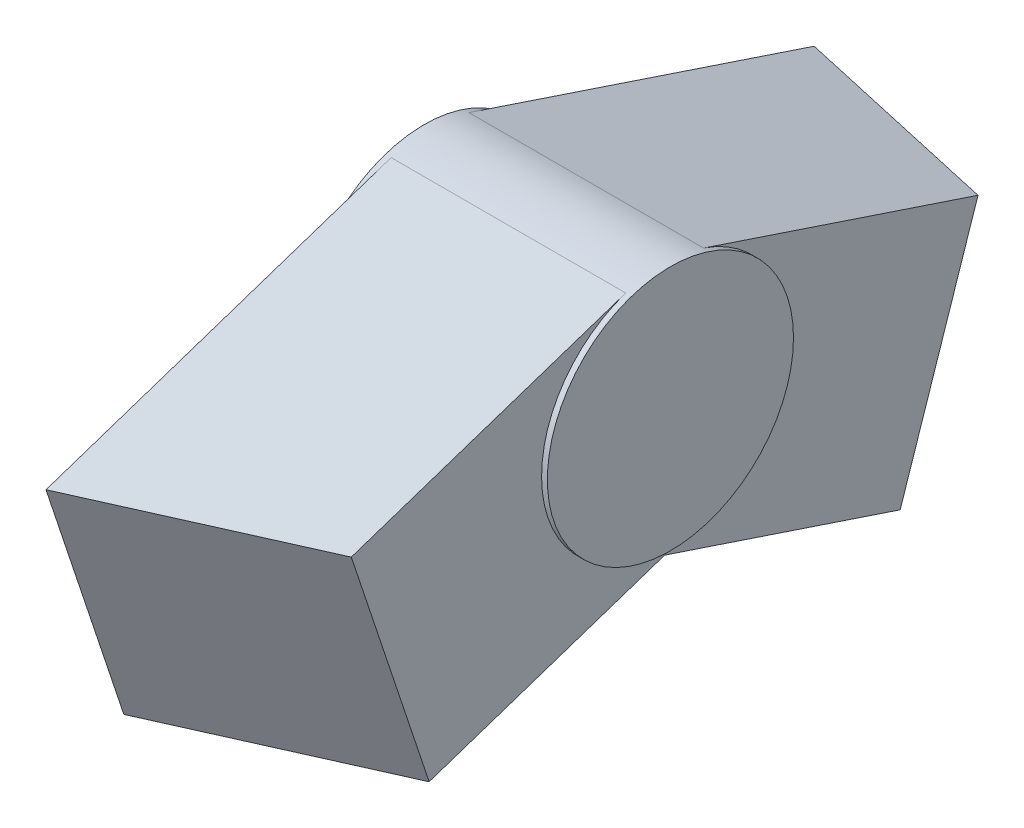
ISO-10303-21;
HEADER;
FILE_DESCRIPTION(('STEP AP214'),'2;1');
FILE_NAME('part.step','',(''),(''),'','','');
FILE_SCHEMA(('AUTOMOTIVE_DESIGN { 1 0 10303 214 1 1 1 1 }'));
ENDSEC;
DATA;
#1=APPLICATION_CONTEXT('core data for automotive mechanical design processes');
#2=APPLICATION_PROTOCOL_DEFINITION('international standard','automotive_design',2000,#1);
#3=PRODUCT_CONTEXT('',#1,'mechanical');
#4=PRODUCT('Part','Part','',(#3));
#5=PRODUCT_RELATED_PRODUCT_CATEGORY('part','',(#4));
#6=PRODUCT_DEFINITION_FORMATION('','',#4);
#7=PRODUCT_DEFINITION_CONTEXT('part definition',#1,'design');
#8=PRODUCT_DEFINITION('design','',#6,#7);
#9=PRODUCT_DEFINITION_SHAPE('','',#8);
#10=(LENGTH_UNIT() NAMED_UNIT(*) SI_UNIT(.MILLI.,.METRE.));
#11=(NAMED_UNIT(*) PLANE_ANGLE_UNIT() SI_UNIT($,.RADIAN.));
#12=(NAMED_UNIT(*) SI_UNIT($,.STERADIAN.) SOLID_ANGLE_UNIT());
#13=UNCERTAINTY_MEASURE_WITH_UNIT(LENGTH_MEASURE(1.E-05),#10,'distance_accuracy_value','');
#14=(GEOMETRIC_REPRESENTATION_CONTEXT(3) GLOBAL_UNCERTAINTY_ASSIGNED_CONTEXT((#13)) GLOBAL_UNIT_ASSIGNED_CONTEXT((#10,
#11,#12)) REPRESENTATION_CONTEXT('',''));
#15=CARTESIAN_POINT('',(0.,0.,0.));
#16=DIRECTION('',(0.,0.,1.));
#17=DIRECTION('',(1.,0.,0.));
#18=AXIS2_PLACEMENT_3D('',#15,#16,#17);
#19=CARTESIAN_POINT('',(101.6,-76.2,-228.6));
#20=DIRECTION('',(-1.,0.,0.));
#21=DIRECTION('',(0.,0.,1.));
#22=AXIS2_PLACEMENT_3D('',#19,#20,#21);
#23=CYLINDRICAL_SURFACE('',#22,19.05);
#24=DIRECTION('',(-1.,0.,0.));
#25=VECTOR('',#24,1.);
#26=CARTESIAN_POINT('',(101.6,-58.1275831721276,-234.624138942624));
#27=LINE('',#26,#25);
#28=CARTESIAN_POINT('',(64.3947123438099,-58.1275831721174,-234.624138942627));
#29=VERTEX_POINT('',#28);
#30=CARTESIAN_POINT('',(100.70528765619,-58.1275831721655,-234.624138942706));
#31=VERTEX_POINT('',#30);
#32=EDGE_CURVE('E124',#29,#31,#27,.F.);
#33=ORIENTED_EDGE('',*,*,#32,.F.);
#34=CARTESIAN_POINT('',(64.3947123438099,-76.2,-228.6));
#35=DIRECTION('',(1.,0.,0.));
#36=DIRECTION('',(0.,0.,-1.));
#37=AXIS2_PLACEMENT_3D('',#34,#35,#36);
#38=CIRCLE('',#37,19.05);
#39=CARTESIAN_POINT('',(64.3947123438099,-58.1275831720802,-222.575861057464));
#40=VERTEX_POINT('',#39);
#41=EDGE_CURVE('E149',#29,#40,#38,.F.);
#42=ORIENTED_EDGE('',*,*,#41,.T.);
#43=DIRECTION('',(-1.,0.,0.));
#44=VECTOR('',#43,1.);
#45=CARTESIAN_POINT('',(101.6,-58.1275831721411,-222.575861057381));
#46=LINE('',#45,#44);
#47=CARTESIAN_POINT('',(100.70528765619,-58.1275831721411,-222.575861057381));
#48=VERTEX_POINT('',#47);
#49=EDGE_CURVE('E58',#40,#48,#46,.F.);
#50=ORIENTED_EDGE('',*,*,#49,.T.);
#51=CARTESIAN_POINT('',(100.70528765619,-76.2,-228.6));
#52=DIRECTION('',(-1.,0.,0.));
#53=DIRECTION('',(0.,0.,1.));
#54=AXIS2_PLACEMENT_3D('',#51,#52,#53);
#55=CIRCLE('',#54,19.05);
#56=EDGE_CURVE('E146',#48,#31,#55,.F.);
#57=ORIENTED_EDGE('',*,*,#56,.T.);
#58=EDGE_LOOP('',(#33,#42,#50,#57));
#59=FACE_BOUND('',#58,.T.);
#60=CARTESIAN_POINT('',(101.6,-76.2,-228.6));
#61=DIRECTION('',(1.,0.,0.));
#62=DIRECTION('',(0.,0.,-1.));
#63=AXIS2_PLACEMENT_3D('',#60,#61,#62);
#64=CIRCLE('',#63,19.05);
#65=CARTESIAN_POINT('',(101.6,-76.2,-247.65));
#66=VERTEX_POINT('',#65);
#67=EDGE_CURVE('E11',#66,#66,#64,.T.);
#68=ORIENTED_EDGE('',*,*,#67,.F.);
#69=EDGE_LOOP('',(#68));
#70=FACE_BOUND('',#69,.T.);
#71=CARTESIAN_POINT('',(63.5,-76.2,-228.6));
#72=DIRECTION('',(1.,0.,0.));
#73=DIRECTION('',(0.,0.,-1.));
#74=AXIS2_PLACEMENT_3D('',#71,#72,#73);
#75=CIRCLE('',#74,19.05);
#76=CARTESIAN_POINT('',(63.5,-76.2,-247.65));
#77=VERTEX_POINT('',#76);
#78=EDGE_CURVE('E39',#77,#77,#75,.T.);
#79=ORIENTED_EDGE('',*,*,#78,.T.);
#80=EDGE_LOOP('',(#79));
#81=FACE_BOUND('',#80,.T.);
#82=ADVANCED_FACE('F36',(#59,#70,#81),#23,.T.);
#83=CARTESIAN_POINT('',(101.6,-76.2,-228.6));
#84=DIRECTION('',(1.,0.,0.));
#85=DIRECTION('',(0.,0.,-1.));
#86=AXIS2_PLACEMENT_3D('',#83,#84,#85);
#87=PLANE('',#86);
#88=ORIENTED_EDGE('',*,*,#67,.T.);
#89=EDGE_LOOP('',(#88));
#90=FACE_BOUND('',#89,.T.);
#91=ADVANCED_FACE('F182',(#90),#87,.T.);
#92=CARTESIAN_POINT('',(63.5,-76.2,-228.6));
#93=DIRECTION('',(1.,0.,0.));
#94=DIRECTION('',(0.,0.,-1.));
#95=AXIS2_PLACEMENT_3D('',#92,#93,#94);
#96=PLANE('',#95);
#97=ORIENTED_EDGE('',*,*,#78,.F.);
#98=EDGE_LOOP('',(#97));
#99=FACE_BOUND('',#98,.T.);
#100=ADVANCED_FACE('F173',(#99),#96,.F.);
#101=CARTESIAN_POINT('',(64.3947123423635,166494.553294634,-500001.101273344));
#102=DIRECTION('',(0.,0.948683298050516,0.31622776601683));
#103=DIRECTION('',(0.,-0.31622776601683,0.948683298050517));
#104=AXIS2_PLACEMENT_3D('',#101,#102,#103);
#105=PLANE('',#104);
#106=DIRECTION('',(0.,-0.31622776601683,0.948683298050516));
#107=VECTOR('',#106,1.);
#108=CARTESIAN_POINT('',(64.3947123423635,166494.553294634,-500001.101273344));
#109=LINE('',#108,#107);
#110=CARTESIAN_POINT('',(64.3947123438099,-96.2804631420511,-228.600000000057));
#111=VERTEX_POINT('',#110);
#112=CARTESIAN_POINT('',(64.39471234381,-112.081209130179,-181.197762035668));
#113=VERTEX_POINT('',#112);
#114=EDGE_CURVE('E143',#111,#113,#109,.T.);
#115=ORIENTED_EDGE('',*,*,#114,.F.);
#116=DIRECTION('',(-1.,0.,0.));
#117=VECTOR('',#116,1.);
#118=CARTESIAN_POINT('',(64.3947123427516,-96.2804631420227,-228.599999999915));
#119=LINE('',#118,#117);
#120=CARTESIAN_POINT('',(100.70528765619,-96.2804631423637,-228.600000000881));
#121=VERTEX_POINT('',#120);
#122=EDGE_CURVE('E98',#121,#111,#119,.T.);
#123=ORIENTED_EDGE('',*,*,#122,.F.);
#124=DIRECTION('',(0.,-0.31622776601683,0.948683298050516));
#125=VECTOR('',#124,1.);
#126=CARTESIAN_POINT('',(100.705287654744,166498.202296148,-500012.048277885));
#127=LINE('',#126,#125);
#128=CARTESIAN_POINT('',(100.70528765619,-108.432207616286,-192.144766577348));
#129=VERTEX_POINT('',#128);
#130=EDGE_CURVE('E144',#121,#129,#127,.T.);
#131=ORIENTED_EDGE('',*,*,#130,.T.);
#132=DIRECTION('',(-0.953033472765887,-0.0957743179499561,0.28732295384987));
#133=VECTOR('',#132,1.);
#134=CARTESIAN_POINT('',(64.39471234381,-112.081209130179,-181.197762035668));
#135=LINE('',#134,#133);
#136=EDGE_CURVE('E135',#129,#113,#135,.T.);
#137=ORIENTED_EDGE('',*,*,#136,.T.);
#138=EDGE_LOOP('',(#115,#123,#131,#137));
#139=FACE_BOUND('',#138,.T.);
#140=ADVANCED_FACE('F161',(#139),#105,.F.);
#141=CARTESIAN_POINT('',(100.705287654744,166534.347129804,-500000.));
#142=DIRECTION('',(-1.,0.,0.));
#143=DIRECTION('',(0.,0.,1.));
#144=AXIS2_PLACEMENT_3D('',#141,#142,#143);
#145=PLANE('',#144);
#146=ORIENTED_EDGE('',*,*,#56,.F.);
#147=DIRECTION('',(0.,-0.31622776601683,0.948683298050516));
#148=VECTOR('',#147,1.);
#149=CARTESIAN_POINT('',(100.705287654744,166534.347129804,-500000.));
#150=LINE('',#149,#148);
#151=CARTESIAN_POINT('',(100.70528765619,-72.2873739605614,-180.096488692107));
#152=VERTEX_POINT('',#151);
#153=EDGE_CURVE('E131',#48,#152,#150,.T.);
#154=ORIENTED_EDGE('',*,*,#153,.T.);
#155=DIRECTION('',(0.,-0.948683298050514,-0.316227766016838));
#156=VECTOR('',#155,1.);
#157=CARTESIAN_POINT('',(100.70528765619,-72.2873739605614,-180.096488692107));
#158=LINE('',#157,#156);
#159=EDGE_CURVE('E127',#152,#129,#158,.T.);
#160=ORIENTED_EDGE('',*,*,#159,.T.);
#161=ORIENTED_EDGE('',*,*,#130,.F.);
#162=DIRECTION('',(0.,-0.31622776601683,-0.948683298050517));
#163=VECTOR('',#162,1.);
#164=CARTESIAN_POINT('',(100.705287654742,166650.602296148,500012.048277885));
#165=LINE('',#164,#163);
#166=CARTESIAN_POINT('',(100.70528765619,-108.432207616286,-265.055233422652));
#167=VERTEX_POINT('',#166);
#168=EDGE_CURVE('E101',#121,#167,#165,.T.);
#169=ORIENTED_EDGE('',*,*,#168,.T.);
#170=DIRECTION('',(0.,-0.948683298050514,0.316227766016838));
#171=VECTOR('',#170,1.);
#172=CARTESIAN_POINT('',(100.70528765619,-72.2873739605614,-277.103511307893));
#173=LINE('',#172,#171);
#174=CARTESIAN_POINT('',(100.70528765619,-72.2873739605614,-277.103511307893));
#175=VERTEX_POINT('',#174);
#176=EDGE_CURVE('E114',#175,#167,#173,.T.);
#177=ORIENTED_EDGE('',*,*,#176,.F.);
#178=DIRECTION('',(0.,-0.31622776601683,-0.948683298050517));
#179=VECTOR('',#178,1.);
#180=CARTESIAN_POINT('',(100.705287654742,166686.747129804,500000.));
#181=LINE('',#180,#179);
#182=EDGE_CURVE('E119',#31,#175,#181,.T.);
#183=ORIENTED_EDGE('',*,*,#182,.F.);
#184=EDGE_LOOP('',(#146,#154,#160,#161,#169,#177,#183));
#185=FACE_BOUND('',#184,.T.);
#186=ADVANCED_FACE('F158',(#185),#145,.F.);
#187=CARTESIAN_POINT('',(-33.4800061517166,33.3153680589674,-99.9461041769024));
#188=DIRECTION('',(0.302864986071011,-0.301375646032025,0.904126938096076));
#189=DIRECTION('',(0.948213667692879,0.,-0.31763318529464));
#190=AXIS2_PLACEMENT_3D('',#187,#188,#189);
#191=PLANE('',#190);
#192=ORIENTED_EDGE('',*,*,#159,.F.);
#193=DIRECTION('',(0.953033472765887,0.0957743179499562,-0.28732295384987));
#194=VECTOR('',#193,1.);
#195=CARTESIAN_POINT('',(64.39471234381,-75.9363754744547,-169.149484150427));
#196=LINE('',#195,#194);
#197=CARTESIAN_POINT('',(64.39471234381,-75.9363754744547,-169.149484150427));
#198=VERTEX_POINT('',#197);
#199=EDGE_CURVE('E128',#198,#152,#196,.T.);
#200=ORIENTED_EDGE('',*,*,#199,.F.);
#201=DIRECTION('',(0.,0.948683298050514,0.316227766016838));
#202=VECTOR('',#201,1.);
#203=CARTESIAN_POINT('',(64.39471234381,-75.9363754744547,-169.149484150427));
#204=LINE('',#203,#202);
#205=EDGE_CURVE('E132',#113,#198,#204,.T.);
#206=ORIENTED_EDGE('',*,*,#205,.F.);
#207=ORIENTED_EDGE('',*,*,#136,.F.);
#208=EDGE_LOOP('',(#192,#200,#206,#207));
#209=FACE_BOUND('',#208,.T.);
#210=ADVANCED_FACE('F168',(#209),#191,.T.);
#211=CARTESIAN_POINT('',(64.3947123423635,166530.69812829,-499989.052995458));
#212=DIRECTION('',(1.,0.,0.));
#213=DIRECTION('',(0.,0.,-1.));
#214=AXIS2_PLACEMENT_3D('',#211,#212,#213);
#215=PLANE('',#214);
#216=ORIENTED_EDGE('',*,*,#41,.F.);
#217=DIRECTION('',(0.,-0.31622776601683,-0.948683298050517));
#218=VECTOR('',#217,1.);
#219=CARTESIAN_POINT('',(64.3947123423622,166683.09812829,499989.052995458));
#220=LINE('',#219,#218);
#221=CARTESIAN_POINT('',(64.39471234381,-75.9363754744547,-288.050515849573));
#222=VERTEX_POINT('',#221);
#223=EDGE_CURVE('E100',#29,#222,#220,.T.);
#224=ORIENTED_EDGE('',*,*,#223,.T.);
#225=DIRECTION('',(0.,0.948683298050514,-0.316227766016838));
#226=VECTOR('',#225,1.);
#227=CARTESIAN_POINT('',(64.39471234381,-75.9363754744547,-288.050515849573));
#228=LINE('',#227,#226);
#229=CARTESIAN_POINT('',(64.39471234381,-112.081209130179,-276.002237964332));
#230=VERTEX_POINT('',#229);
#231=EDGE_CURVE('E104',#230,#222,#228,.T.);
#232=ORIENTED_EDGE('',*,*,#231,.F.);
#233=DIRECTION('',(0.,-0.31622776601683,-0.948683298050517));
#234=VECTOR('',#233,1.);
#235=CARTESIAN_POINT('',(64.3947123423622,166646.953294634,500001.101273344));
#236=LINE('',#235,#234);
#237=EDGE_CURVE('E50',#111,#230,#236,.T.);
#238=ORIENTED_EDGE('',*,*,#237,.F.);
#239=ORIENTED_EDGE('',*,*,#114,.T.);
#240=ORIENTED_EDGE('',*,*,#205,.T.);
#241=DIRECTION('',(0.,-0.31622776601683,0.948683298050516));
#242=VECTOR('',#241,1.);
#243=CARTESIAN_POINT('',(64.3947123423635,166530.69812829,-499989.052995458));
#244=LINE('',#243,#242);
#245=EDGE_CURVE('E141',#40,#198,#244,.T.);
#246=ORIENTED_EDGE('',*,*,#245,.F.);
#247=EDGE_LOOP('',(#216,#224,#232,#238,#239,#240,#246));
#248=FACE_BOUND('',#247,.T.);
#249=ADVANCED_FACE('F105',(#248),#215,.F.);
#250=CARTESIAN_POINT('',(64.3947123423635,166530.69812829,-499989.052995458));
#251=DIRECTION('',(0.,-0.948683298050517,-0.31622776601683));
#252=DIRECTION('',(0.,0.31622776601683,-0.948683298050517));
#253=AXIS2_PLACEMENT_3D('',#250,#251,#252);
#254=PLANE('',#253);
#255=ORIENTED_EDGE('',*,*,#49,.F.);
#256=ORIENTED_EDGE('',*,*,#245,.T.);
#257=ORIENTED_EDGE('',*,*,#199,.T.);
#258=ORIENTED_EDGE('',*,*,#153,.F.);
#259=EDGE_LOOP('',(#255,#256,#257,#258));
#260=FACE_BOUND('',#259,.T.);
#261=ADVANCED_FACE('F170',(#260),#254,.F.);
#262=CARTESIAN_POINT('',(64.3947123423622,166683.09812829,499989.052995458));
#263=DIRECTION('',(0.,0.948683298050516,-0.31622776601683));
#264=DIRECTION('',(0.,0.31622776601683,0.948683298050517));
#265=AXIS2_PLACEMENT_3D('',#262,#263,#264);
#266=PLANE('',#265);
#267=ORIENTED_EDGE('',*,*,#223,.F.);
#268=ORIENTED_EDGE('',*,*,#32,.T.);
#269=ORIENTED_EDGE('',*,*,#182,.T.);
#270=DIRECTION('',(0.953033472765887,0.0957743179499562,0.28732295384987));
#271=VECTOR('',#270,1.);
#272=CARTESIAN_POINT('',(64.39471234381,-75.9363754744547,-288.050515849573));
#273=LINE('',#272,#271);
#274=EDGE_CURVE('E110',#222,#175,#273,.T.);
#275=ORIENTED_EDGE('',*,*,#274,.F.);
#276=EDGE_LOOP('',(#267,#268,#269,#275));
#277=FACE_BOUND('',#276,.T.);
#278=ADVANCED_FACE('F157',(#277),#266,.T.);
#279=CARTESIAN_POINT('',(-33.4800061517166,33.3153680589674,-357.253895823098));
#280=DIRECTION('',(0.302864986071011,-0.301375646032025,-0.904126938096076));
#281=DIRECTION('',(0.948213667692879,0.,0.31763318529464));
#282=AXIS2_PLACEMENT_3D('',#279,#280,#281);
#283=PLANE('',#282);
#284=ORIENTED_EDGE('',*,*,#176,.T.);
#285=DIRECTION('',(-0.953033472765887,-0.0957743179499561,-0.28732295384987));
#286=VECTOR('',#285,1.);
#287=CARTESIAN_POINT('',(64.39471234381,-112.081209130179,-276.002237964332));
#288=LINE('',#287,#286);
#289=EDGE_CURVE('E95',#167,#230,#288,.T.);
#290=ORIENTED_EDGE('',*,*,#289,.T.);
#291=ORIENTED_EDGE('',*,*,#231,.T.);
#292=ORIENTED_EDGE('',*,*,#274,.T.);
#293=EDGE_LOOP('',(#284,#290,#291,#292));
#294=FACE_BOUND('',#293,.T.);
#295=ADVANCED_FACE('F112',(#294),#283,.T.);
#296=CARTESIAN_POINT('',(64.3947123423622,166646.953294634,500001.101273344));
#297=DIRECTION('',(0.,-0.948683298050517,0.31622776601683));
#298=DIRECTION('',(0.,-0.31622776601683,-0.948683298050517));
#299=AXIS2_PLACEMENT_3D('',#296,#297,#298);
#300=PLANE('',#299);
#301=ORIENTED_EDGE('',*,*,#168,.F.);
#302=ORIENTED_EDGE('',*,*,#122,.T.);
#303=ORIENTED_EDGE('',*,*,#237,.T.);
#304=ORIENTED_EDGE('',*,*,#289,.F.);
#305=EDGE_LOOP('',(#301,#302,#303,#304));
#306=FACE_BOUND('',#305,.T.);
#307=ADVANCED_FACE('F93',(#306),#300,.T.);
#308=CLOSED_SHELL('',(#82,#91,#100,#140,#186,#210,#249,#261,#278,#295,#307));
#309=MANIFOLD_SOLID_BREP('B2',#308);
#310=ADVANCED_BREP_SHAPE_REPRESENTATION('',(#18,#309),#14);
#311=SHAPE_DEFINITION_REPRESENTATION(#9,#310);
ENDSEC;
END-ISO-10303-21;
